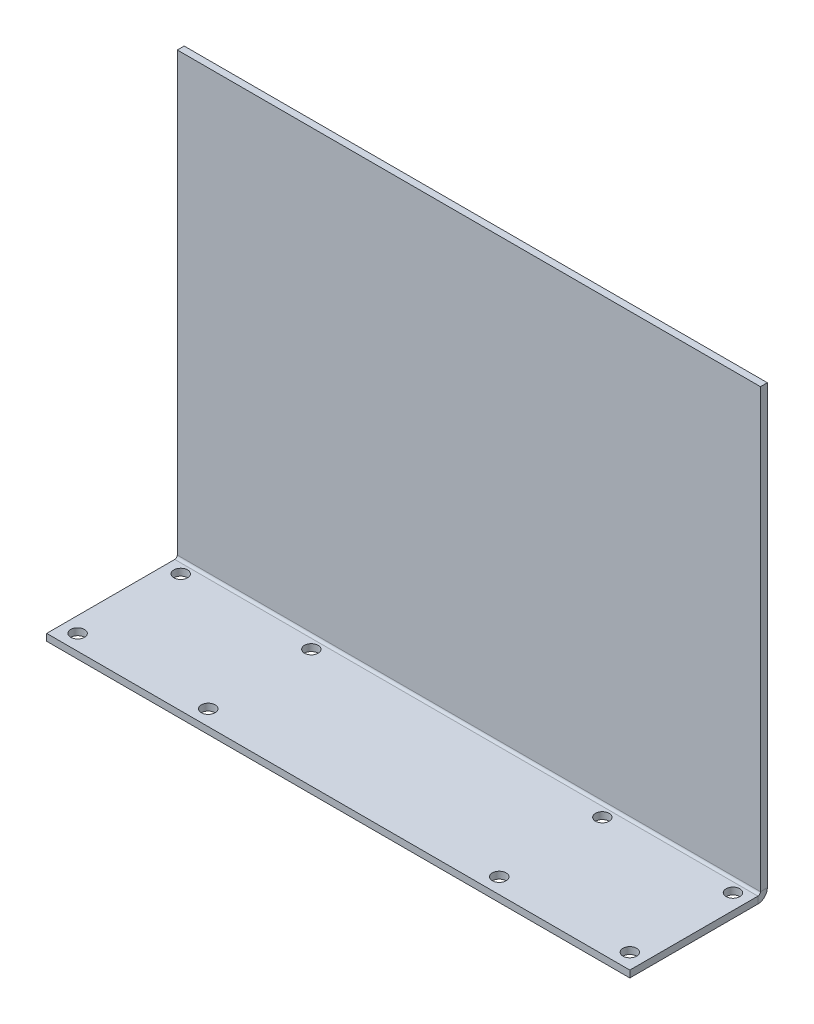
ISO-10303-21;
HEADER;
FILE_DESCRIPTION(('STEP AP214'),'2;1');
FILE_NAME('part.step','',(''),(''),'','','');
FILE_SCHEMA(('AUTOMOTIVE_DESIGN { 1 0 10303 214 1 1 1 1 }'));
ENDSEC;
DATA;
#1=APPLICATION_CONTEXT('core data for automotive mechanical design processes');
#2=APPLICATION_PROTOCOL_DEFINITION('international standard','automotive_design',2000,#1);
#3=PRODUCT_CONTEXT('',#1,'mechanical');
#4=PRODUCT('Part','Part','',(#3));
#5=PRODUCT_RELATED_PRODUCT_CATEGORY('part','',(#4));
#6=PRODUCT_DEFINITION_FORMATION('','',#4);
#7=PRODUCT_DEFINITION_CONTEXT('part definition',#1,'design');
#8=PRODUCT_DEFINITION('design','',#6,#7);
#9=PRODUCT_DEFINITION_SHAPE('','',#8);
#10=(LENGTH_UNIT() NAMED_UNIT(*) SI_UNIT(.MILLI.,.METRE.));
#11=(NAMED_UNIT(*) PLANE_ANGLE_UNIT() SI_UNIT($,.RADIAN.));
#12=(NAMED_UNIT(*) SI_UNIT($,.STERADIAN.) SOLID_ANGLE_UNIT());
#13=UNCERTAINTY_MEASURE_WITH_UNIT(LENGTH_MEASURE(1.E-05),#10,'distance_accuracy_value','');
#14=(GEOMETRIC_REPRESENTATION_CONTEXT(3) GLOBAL_UNCERTAINTY_ASSIGNED_CONTEXT((#13)) GLOBAL_UNIT_ASSIGNED_CONTEXT((#10,
#11,#12)) REPRESENTATION_CONTEXT('',''));
#15=CARTESIAN_POINT('',(0.,0.,0.));
#16=DIRECTION('',(0.,0.,1.));
#17=DIRECTION('',(1.,0.,0.));
#18=AXIS2_PLACEMENT_3D('',#15,#16,#17);
#19=CARTESIAN_POINT('',(-70.6153846153846,-2.,-33.2307692307692));
#20=DIRECTION('',(-1.,0.,0.));
#21=DIRECTION('',(0.,0.,1.));
#22=AXIS2_PLACEMENT_3D('',#19,#20,#21);
#23=PLANE('',#22);
#24=DIRECTION('',(0.,0.,1.));
#25=VECTOR('',#24,1.);
#26=CARTESIAN_POINT('',(-70.6153846153846,0.,-33.2307692307692));
#27=LINE('',#26,#25);
#28=CARTESIAN_POINT('',(-70.6153846153846,0.,-30.4941692307692));
#29=VERTEX_POINT('',#28);
#30=CARTESIAN_POINT('',(-70.6153846153846,0.,6.76923076923076));
#31=VERTEX_POINT('',#30);
#32=EDGE_CURVE('E107',#29,#31,#27,.T.);
#33=ORIENTED_EDGE('',*,*,#32,.F.);
#34=DIRECTION('',(0.,-1.,0.));
#35=VECTOR('',#34,1.);
#36=CARTESIAN_POINT('',(-70.6153846153846,0.,-30.4941692307692));
#37=LINE('',#36,#35);
#38=CARTESIAN_POINT('',(-70.6153846153846,-2.,-30.4941692307692));
#39=VERTEX_POINT('',#38);
#40=EDGE_CURVE('E116',#29,#39,#37,.T.);
#41=ORIENTED_EDGE('',*,*,#40,.T.);
#42=DIRECTION('',(0.,0.,1.));
#43=VECTOR('',#42,1.);
#44=CARTESIAN_POINT('',(-70.6153846153846,-2.,-33.2307692307692));
#45=LINE('',#44,#43);
#46=CARTESIAN_POINT('',(-70.6153846153846,-2.,6.76923076923076));
#47=VERTEX_POINT('',#46);
#48=EDGE_CURVE('E104',#39,#47,#45,.T.);
#49=ORIENTED_EDGE('',*,*,#48,.T.);
#50=DIRECTION('',(0.,1.,0.));
#51=VECTOR('',#50,1.);
#52=CARTESIAN_POINT('',(-70.6153846153846,-2.,6.76923076923076));
#53=LINE('',#52,#51);
#54=EDGE_CURVE('E62',#47,#31,#53,.T.);
#55=ORIENTED_EDGE('',*,*,#54,.T.);
#56=EDGE_LOOP('',(#33,#41,#49,#55));
#57=FACE_BOUND('',#56,.T.);
#58=ADVANCED_FACE('F59',(#57),#23,.T.);
#59=CARTESIAN_POINT('',(0.,-2.,0.));
#60=DIRECTION('',(0.,1.,0.));
#61=DIRECTION('',(0.,0.,1.));
#62=AXIS2_PLACEMENT_3D('',#59,#60,#61);
#63=PLANE('',#62);
#64=CARTESIAN_POINT('',(56.5546153846154,-2.,-27.7307692307692));
#65=DIRECTION('',(0.,1.,0.));
#66=DIRECTION('',(0.,0.,1.));
#67=AXIS2_PLACEMENT_3D('',#64,#65,#66);
#68=CIRCLE('',#67,2.);
#69=CARTESIAN_POINT('',(56.5546153846154,-2.,-25.7307692307692));
#70=VERTEX_POINT('',#69);
#71=EDGE_CURVE('E217',#70,#70,#68,.T.);
#72=ORIENTED_EDGE('',*,*,#71,.T.);
#73=EDGE_LOOP('',(#72));
#74=FACE_BOUND('',#73,.T.);
#75=CARTESIAN_POINT('',(94.5546153846154,-2.,-27.7307692307692));
#76=DIRECTION('',(0.,1.,0.));
#77=DIRECTION('',(0.,0.,1.));
#78=AXIS2_PLACEMENT_3D('',#75,#76,#77);
#79=CIRCLE('',#78,2.);
#80=CARTESIAN_POINT('',(94.5546153846154,-2.,-25.7307692307692));
#81=VERTEX_POINT('',#80);
#82=EDGE_CURVE('E211',#81,#81,#79,.T.);
#83=ORIENTED_EDGE('',*,*,#82,.T.);
#84=EDGE_LOOP('',(#83));
#85=FACE_BOUND('',#84,.T.);
#86=CARTESIAN_POINT('',(94.5546153846154,-2.,2.26923076923076));
#87=DIRECTION('',(0.,1.,0.));
#88=DIRECTION('',(0.,0.,1.));
#89=AXIS2_PLACEMENT_3D('',#86,#87,#88);
#90=CIRCLE('',#89,2.);
#91=CARTESIAN_POINT('',(94.5546153846154,-2.,4.26923076923076));
#92=VERTEX_POINT('',#91);
#93=EDGE_CURVE('E205',#92,#92,#90,.T.);
#94=ORIENTED_EDGE('',*,*,#93,.T.);
#95=EDGE_LOOP('',(#94));
#96=FACE_BOUND('',#95,.T.);
#97=CARTESIAN_POINT('',(56.5546153846154,-2.,2.26923076923076));
#98=DIRECTION('',(0.,1.,0.));
#99=DIRECTION('',(0.,0.,1.));
#100=AXIS2_PLACEMENT_3D('',#97,#98,#99);
#101=CIRCLE('',#100,2.);
#102=CARTESIAN_POINT('',(56.5546153846154,-2.,4.26923076923076));
#103=VERTEX_POINT('',#102);
#104=EDGE_CURVE('E199',#103,#103,#101,.T.);
#105=ORIENTED_EDGE('',*,*,#104,.T.);
#106=EDGE_LOOP('',(#105));
#107=FACE_BOUND('',#106,.T.);
#108=CARTESIAN_POINT('',(-66.1153846153846,-2.,-27.7307692307692));
#109=DIRECTION('',(0.,1.,0.));
#110=DIRECTION('',(0.,0.,1.));
#111=AXIS2_PLACEMENT_3D('',#108,#109,#110);
#112=CIRCLE('',#111,2.);
#113=CARTESIAN_POINT('',(-66.1153846153846,-2.,-25.7307692307692));
#114=VERTEX_POINT('',#113);
#115=EDGE_CURVE('E193',#114,#114,#112,.T.);
#116=ORIENTED_EDGE('',*,*,#115,.T.);
#117=EDGE_LOOP('',(#116));
#118=FACE_BOUND('',#117,.T.);
#119=CARTESIAN_POINT('',(-28.1153846153846,-2.,-27.7307692307692));
#120=DIRECTION('',(0.,1.,0.));
#121=DIRECTION('',(0.,0.,1.));
#122=AXIS2_PLACEMENT_3D('',#119,#120,#121);
#123=CIRCLE('',#122,2.);
#124=CARTESIAN_POINT('',(-28.1153846153846,-2.,-25.7307692307692));
#125=VERTEX_POINT('',#124);
#126=EDGE_CURVE('E187',#125,#125,#123,.T.);
#127=ORIENTED_EDGE('',*,*,#126,.T.);
#128=EDGE_LOOP('',(#127));
#129=FACE_BOUND('',#128,.T.);
#130=CARTESIAN_POINT('',(-28.1153846153846,-2.,2.26923076923075));
#131=DIRECTION('',(0.,1.,0.));
#132=DIRECTION('',(0.,0.,1.));
#133=AXIS2_PLACEMENT_3D('',#130,#131,#132);
#134=CIRCLE('',#133,2.);
#135=CARTESIAN_POINT('',(-28.1153846153846,-2.,4.26923076923075));
#136=VERTEX_POINT('',#135);
#137=EDGE_CURVE('E181',#136,#136,#134,.T.);
#138=ORIENTED_EDGE('',*,*,#137,.T.);
#139=EDGE_LOOP('',(#138));
#140=FACE_BOUND('',#139,.T.);
#141=CARTESIAN_POINT('',(-66.1153846153846,-2.,2.26923076923076));
#142=DIRECTION('',(0.,1.,0.));
#143=DIRECTION('',(0.,0.,1.));
#144=AXIS2_PLACEMENT_3D('',#141,#142,#143);
#145=CIRCLE('',#144,2.);
#146=CARTESIAN_POINT('',(-66.1153846153846,-2.,4.26923076923076));
#147=VERTEX_POINT('',#146);
#148=EDGE_CURVE('E175',#147,#147,#145,.T.);
#149=ORIENTED_EDGE('',*,*,#148,.T.);
#150=EDGE_LOOP('',(#149));
#151=FACE_BOUND('',#150,.T.);
#152=DIRECTION('',(-1.,0.,0.));
#153=VECTOR('',#152,1.);
#154=CARTESIAN_POINT('',(-70.6153846153846,-2.,-30.4941692307692));
#155=LINE('',#154,#153);
#156=CARTESIAN_POINT('',(99.0546153846153,-2.,-30.4941692307692));
#157=VERTEX_POINT('',#156);
#158=EDGE_CURVE('E132',#39,#157,#155,.F.);
#159=ORIENTED_EDGE('',*,*,#158,.T.);
#160=DIRECTION('',(0.,0.,-1.));
#161=VECTOR('',#160,1.);
#162=CARTESIAN_POINT('',(99.0546153846153,-2.,-33.2307692307692));
#163=LINE('',#162,#161);
#164=CARTESIAN_POINT('',(99.0546153846154,-2.,6.76923076923076));
#165=VERTEX_POINT('',#164);
#166=EDGE_CURVE('E112',#165,#157,#163,.T.);
#167=ORIENTED_EDGE('',*,*,#166,.F.);
#168=DIRECTION('',(1.,0.,0.));
#169=VECTOR('',#168,1.);
#170=CARTESIAN_POINT('',(-70.6153846153846,-2.,6.76923076923076));
#171=LINE('',#170,#169);
#172=EDGE_CURVE('E97',#47,#165,#171,.T.);
#173=ORIENTED_EDGE('',*,*,#172,.F.);
#174=ORIENTED_EDGE('',*,*,#48,.F.);
#175=EDGE_LOOP('',(#159,#167,#173,#174));
#176=FACE_BOUND('',#175,.T.);
#177=ADVANCED_FACE('F221',(#74,#85,#96,#107,#118,#129,#140,#151,#176),#63,.F.);
#178=CARTESIAN_POINT('',(0.,0.,0.));
#179=DIRECTION('',(0.,1.,0.));
#180=DIRECTION('',(0.,0.,1.));
#181=AXIS2_PLACEMENT_3D('',#178,#179,#180);
#182=PLANE('',#181);
#183=CARTESIAN_POINT('',(56.5546153846154,0.,-27.7307692307692));
#184=DIRECTION('',(0.,1.,0.));
#185=DIRECTION('',(0.,0.,1.));
#186=AXIS2_PLACEMENT_3D('',#183,#184,#185);
#187=CIRCLE('',#186,2.);
#188=CARTESIAN_POINT('',(56.5546153846154,0.,-25.7307692307692));
#189=VERTEX_POINT('',#188);
#190=EDGE_CURVE('E214',#189,#189,#187,.T.);
#191=ORIENTED_EDGE('',*,*,#190,.F.);
#192=EDGE_LOOP('',(#191));
#193=FACE_BOUND('',#192,.T.);
#194=CARTESIAN_POINT('',(94.5546153846154,0.,-27.7307692307692));
#195=DIRECTION('',(0.,1.,0.));
#196=DIRECTION('',(0.,0.,1.));
#197=AXIS2_PLACEMENT_3D('',#194,#195,#196);
#198=CIRCLE('',#197,2.);
#199=CARTESIAN_POINT('',(94.5546153846154,0.,-25.7307692307692));
#200=VERTEX_POINT('',#199);
#201=EDGE_CURVE('E208',#200,#200,#198,.T.);
#202=ORIENTED_EDGE('',*,*,#201,.F.);
#203=EDGE_LOOP('',(#202));
#204=FACE_BOUND('',#203,.T.);
#205=CARTESIAN_POINT('',(94.5546153846154,0.,2.26923076923076));
#206=DIRECTION('',(0.,1.,0.));
#207=DIRECTION('',(0.,0.,1.));
#208=AXIS2_PLACEMENT_3D('',#205,#206,#207);
#209=CIRCLE('',#208,2.);
#210=CARTESIAN_POINT('',(94.5546153846154,0.,4.26923076923076));
#211=VERTEX_POINT('',#210);
#212=EDGE_CURVE('E202',#211,#211,#209,.T.);
#213=ORIENTED_EDGE('',*,*,#212,.F.);
#214=EDGE_LOOP('',(#213));
#215=FACE_BOUND('',#214,.T.);
#216=CARTESIAN_POINT('',(56.5546153846154,0.,2.26923076923076));
#217=DIRECTION('',(0.,1.,0.));
#218=DIRECTION('',(0.,0.,1.));
#219=AXIS2_PLACEMENT_3D('',#216,#217,#218);
#220=CIRCLE('',#219,2.);
#221=CARTESIAN_POINT('',(56.5546153846154,0.,4.26923076923076));
#222=VERTEX_POINT('',#221);
#223=EDGE_CURVE('E196',#222,#222,#220,.T.);
#224=ORIENTED_EDGE('',*,*,#223,.F.);
#225=EDGE_LOOP('',(#224));
#226=FACE_BOUND('',#225,.T.);
#227=CARTESIAN_POINT('',(-66.1153846153846,0.,-27.7307692307692));
#228=DIRECTION('',(0.,1.,0.));
#229=DIRECTION('',(0.,0.,1.));
#230=AXIS2_PLACEMENT_3D('',#227,#228,#229);
#231=CIRCLE('',#230,2.);
#232=CARTESIAN_POINT('',(-66.1153846153846,0.,-25.7307692307692));
#233=VERTEX_POINT('',#232);
#234=EDGE_CURVE('E190',#233,#233,#231,.T.);
#235=ORIENTED_EDGE('',*,*,#234,.F.);
#236=EDGE_LOOP('',(#235));
#237=FACE_BOUND('',#236,.T.);
#238=CARTESIAN_POINT('',(-28.1153846153846,0.,-27.7307692307692));
#239=DIRECTION('',(0.,1.,0.));
#240=DIRECTION('',(0.,0.,1.));
#241=AXIS2_PLACEMENT_3D('',#238,#239,#240);
#242=CIRCLE('',#241,2.);
#243=CARTESIAN_POINT('',(-28.1153846153846,0.,-25.7307692307692));
#244=VERTEX_POINT('',#243);
#245=EDGE_CURVE('E184',#244,#244,#242,.T.);
#246=ORIENTED_EDGE('',*,*,#245,.F.);
#247=EDGE_LOOP('',(#246));
#248=FACE_BOUND('',#247,.T.);
#249=CARTESIAN_POINT('',(-28.1153846153846,0.,2.26923076923075));
#250=DIRECTION('',(0.,1.,0.));
#251=DIRECTION('',(0.,0.,1.));
#252=AXIS2_PLACEMENT_3D('',#249,#250,#251);
#253=CIRCLE('',#252,2.);
#254=CARTESIAN_POINT('',(-28.1153846153846,0.,4.26923076923075));
#255=VERTEX_POINT('',#254);
#256=EDGE_CURVE('E178',#255,#255,#253,.T.);
#257=ORIENTED_EDGE('',*,*,#256,.F.);
#258=EDGE_LOOP('',(#257));
#259=FACE_BOUND('',#258,.T.);
#260=CARTESIAN_POINT('',(-66.1153846153846,0.,2.26923076923076));
#261=DIRECTION('',(0.,1.,0.));
#262=DIRECTION('',(0.,0.,1.));
#263=AXIS2_PLACEMENT_3D('',#260,#261,#262);
#264=CIRCLE('',#263,2.);
#265=CARTESIAN_POINT('',(-66.1153846153846,0.,4.26923076923076));
#266=VERTEX_POINT('',#265);
#267=EDGE_CURVE('E141',#266,#266,#264,.T.);
#268=ORIENTED_EDGE('',*,*,#267,.F.);
#269=EDGE_LOOP('',(#268));
#270=FACE_BOUND('',#269,.T.);
#271=DIRECTION('',(0.,0.,-1.));
#272=VECTOR('',#271,1.);
#273=CARTESIAN_POINT('',(99.0546153846153,0.,-33.2307692307692));
#274=LINE('',#273,#272);
#275=CARTESIAN_POINT('',(99.0546153846154,0.,6.76923076923076));
#276=VERTEX_POINT('',#275);
#277=CARTESIAN_POINT('',(99.0546153846153,0.,-30.4941692307692));
#278=VERTEX_POINT('',#277);
#279=EDGE_CURVE('E99',#276,#278,#274,.T.);
#280=ORIENTED_EDGE('',*,*,#279,.T.);
#281=DIRECTION('',(-1.,0.,0.));
#282=VECTOR('',#281,1.);
#283=CARTESIAN_POINT('',(-70.6153846153846,0.,-30.4941692307692));
#284=LINE('',#283,#282);
#285=EDGE_CURVE('E73',#29,#278,#284,.F.);
#286=ORIENTED_EDGE('',*,*,#285,.F.);
#287=ORIENTED_EDGE('',*,*,#32,.T.);
#288=DIRECTION('',(1.,0.,0.));
#289=VECTOR('',#288,1.);
#290=CARTESIAN_POINT('',(-70.6153846153846,0.,6.76923076923076));
#291=LINE('',#290,#289);
#292=EDGE_CURVE('E95',#31,#276,#291,.T.);
#293=ORIENTED_EDGE('',*,*,#292,.T.);
#294=EDGE_LOOP('',(#280,#286,#287,#293));
#295=FACE_BOUND('',#294,.T.);
#296=ADVANCED_FACE('F106',(#193,#204,#215,#226,#237,#248,#259,#270,#295),#182,.T.);
#297=CARTESIAN_POINT('',(99.0546153846153,-2.,-33.2307692307692));
#298=DIRECTION('',(1.,0.,0.));
#299=DIRECTION('',(0.,0.,-1.));
#300=AXIS2_PLACEMENT_3D('',#297,#298,#299);
#301=PLANE('',#300);
#302=DIRECTION('',(0.,-1.,0.));
#303=VECTOR('',#302,1.);
#304=CARTESIAN_POINT('',(99.0546153846153,0.,-30.4941692307692));
#305=LINE('',#304,#303);
#306=EDGE_CURVE('E103',#278,#157,#305,.T.);
#307=ORIENTED_EDGE('',*,*,#306,.F.);
#308=ORIENTED_EDGE('',*,*,#279,.F.);
#309=DIRECTION('',(0.,1.,0.));
#310=VECTOR('',#309,1.);
#311=CARTESIAN_POINT('',(99.0546153846154,-2.,6.76923076923076));
#312=LINE('',#311,#310);
#313=EDGE_CURVE('E13',#165,#276,#312,.T.);
#314=ORIENTED_EDGE('',*,*,#313,.F.);
#315=ORIENTED_EDGE('',*,*,#166,.T.);
#316=EDGE_LOOP('',(#307,#308,#314,#315));
#317=FACE_BOUND('',#316,.T.);
#318=ADVANCED_FACE('F100',(#317),#301,.T.);
#319=CARTESIAN_POINT('',(-70.6153846153846,-2.,6.76923076923076));
#320=DIRECTION('',(0.,0.,1.));
#321=DIRECTION('',(1.,0.,0.));
#322=AXIS2_PLACEMENT_3D('',#319,#320,#321);
#323=PLANE('',#322);
#324=ORIENTED_EDGE('',*,*,#292,.F.);
#325=ORIENTED_EDGE('',*,*,#54,.F.);
#326=ORIENTED_EDGE('',*,*,#172,.T.);
#327=ORIENTED_EDGE('',*,*,#313,.T.);
#328=EDGE_LOOP('',(#324,#325,#326,#327));
#329=FACE_BOUND('',#328,.T.);
#330=ADVANCED_FACE('F92',(#329),#323,.T.);
#331=CARTESIAN_POINT('',(99.0546153846153,0.736599999999989,-30.4941692307692));
#332=DIRECTION('',(1.,0.,0.));
#333=DIRECTION('',(0.,1.,0.));
#334=AXIS2_PLACEMENT_3D('',#331,#332,#333);
#335=PLANE('',#334);
#336=DIRECTION('',(0.,0.,1.));
#337=VECTOR('',#336,1.);
#338=CARTESIAN_POINT('',(99.0546153846153,0.736600000000011,-33.2307692307692));
#339=LINE('',#338,#337);
#340=CARTESIAN_POINT('',(99.0546153846153,0.736599999999986,-31.2307692307692));
#341=VERTEX_POINT('',#340);
#342=CARTESIAN_POINT('',(99.0546153846153,0.736599999999979,-33.2307692307692));
#343=VERTEX_POINT('',#342);
#344=EDGE_CURVE('E137',#341,#343,#339,.F.);
#345=ORIENTED_EDGE('',*,*,#344,.F.);
#346=CARTESIAN_POINT('',(99.0546153846153,0.736599999999989,-30.4941692307692));
#347=DIRECTION('',(-1.,0.,0.));
#348=DIRECTION('',(0.,-1.,0.));
#349=AXIS2_PLACEMENT_3D('',#346,#347,#348);
#350=CIRCLE('',#349,0.7366);
#351=EDGE_CURVE('E126',#278,#341,#350,.F.);
#352=ORIENTED_EDGE('',*,*,#351,.F.);
#353=ORIENTED_EDGE('',*,*,#306,.T.);
#354=CARTESIAN_POINT('',(99.0546153846153,0.736599999999989,-30.4941692307692));
#355=DIRECTION('',(-1.,0.,0.));
#356=DIRECTION('',(0.,-1.,0.));
#357=AXIS2_PLACEMENT_3D('',#354,#355,#356);
#358=CIRCLE('',#357,2.7366);
#359=EDGE_CURVE('E119',#157,#343,#358,.F.);
#360=ORIENTED_EDGE('',*,*,#359,.T.);
#361=EDGE_LOOP('',(#345,#352,#353,#360));
#362=FACE_BOUND('',#361,.T.);
#363=ADVANCED_FACE('F318',(#362),#335,.T.);
#364=CARTESIAN_POINT('',(-70.6153846153846,0.736600000000002,-30.4941692307692));
#365=DIRECTION('',(1.,0.,0.));
#366=DIRECTION('',(0.,1.,0.));
#367=AXIS2_PLACEMENT_3D('',#364,#365,#366);
#368=PLANE('',#367);
#369=CARTESIAN_POINT('',(-70.6153846153846,0.736600000000002,-30.4941692307692));
#370=DIRECTION('',(-1.,0.,0.));
#371=DIRECTION('',(0.,-1.,0.));
#372=AXIS2_PLACEMENT_3D('',#369,#370,#371);
#373=CIRCLE('',#372,0.7366);
#374=CARTESIAN_POINT('',(-70.6153846153846,0.736599999999999,-31.2307692307692));
#375=VERTEX_POINT('',#374);
#376=EDGE_CURVE('E121',#375,#29,#373,.T.);
#377=ORIENTED_EDGE('',*,*,#376,.F.);
#378=DIRECTION('',(0.,0.,1.));
#379=VECTOR('',#378,1.);
#380=CARTESIAN_POINT('',(-70.6153846153846,0.736600000000004,-31.2307692307692));
#381=LINE('',#380,#379);
#382=CARTESIAN_POINT('',(-70.6153846153846,0.736600000000018,-33.2307692307692));
#383=VERTEX_POINT('',#382);
#384=EDGE_CURVE('E144',#375,#383,#381,.F.);
#385=ORIENTED_EDGE('',*,*,#384,.T.);
#386=CARTESIAN_POINT('',(-70.6153846153846,0.736600000000002,-30.4941692307692));
#387=DIRECTION('',(-1.,0.,0.));
#388=DIRECTION('',(0.,-1.,0.));
#389=AXIS2_PLACEMENT_3D('',#386,#387,#388);
#390=CIRCLE('',#389,2.7366);
#391=EDGE_CURVE('E129',#383,#39,#390,.T.);
#392=ORIENTED_EDGE('',*,*,#391,.T.);
#393=ORIENTED_EDGE('',*,*,#40,.F.);
#394=EDGE_LOOP('',(#377,#385,#392,#393));
#395=FACE_BOUND('',#394,.T.);
#396=ADVANCED_FACE('F277',(#395),#368,.F.);
#397=CARTESIAN_POINT('',(-70.6153846153846,0.736600000000002,-30.4941692307692));
#398=DIRECTION('',(-1.,0.,0.));
#399=DIRECTION('',(0.,0.,-1.));
#400=AXIS2_PLACEMENT_3D('',#397,#398,#399);
#401=CYLINDRICAL_SURFACE('',#400,2.7366);
#402=ORIENTED_EDGE('',*,*,#158,.F.);
#403=ORIENTED_EDGE('',*,*,#391,.F.);
#404=DIRECTION('',(-1.,0.,0.));
#405=VECTOR('',#404,1.);
#406=CARTESIAN_POINT('',(99.0546153846153,0.736600000000011,-33.2307692307692));
#407=LINE('',#406,#405);
#408=EDGE_CURVE('E147',#383,#343,#407,.F.);
#409=ORIENTED_EDGE('',*,*,#408,.T.);
#410=ORIENTED_EDGE('',*,*,#359,.F.);
#411=EDGE_LOOP('',(#402,#403,#409,#410));
#412=FACE_BOUND('',#411,.T.);
#413=ADVANCED_FACE('F319',(#412),#401,.T.);
#414=CARTESIAN_POINT('',(-70.6153846153846,0.736600000000002,-30.4941692307692));
#415=DIRECTION('',(-1.,0.,0.));
#416=DIRECTION('',(0.,0.,-1.));
#417=AXIS2_PLACEMENT_3D('',#414,#415,#416);
#418=CYLINDRICAL_SURFACE('',#417,0.7366);
#419=ORIENTED_EDGE('',*,*,#285,.T.);
#420=ORIENTED_EDGE('',*,*,#351,.T.);
#421=DIRECTION('',(-1.,0.,0.));
#422=VECTOR('',#421,1.);
#423=CARTESIAN_POINT('',(99.0546153846153,0.736599999999997,-31.2307692307692));
#424=LINE('',#423,#422);
#425=EDGE_CURVE('E140',#341,#375,#424,.T.);
#426=ORIENTED_EDGE('',*,*,#425,.T.);
#427=ORIENTED_EDGE('',*,*,#376,.T.);
#428=EDGE_LOOP('',(#419,#420,#426,#427));
#429=FACE_BOUND('',#428,.T.);
#430=ADVANCED_FACE('F282',(#429),#418,.F.);
#431=CARTESIAN_POINT('',(99.0546153846153,0.,-33.2307692307692));
#432=DIRECTION('',(-1.,0.,0.));
#433=DIRECTION('',(0.,0.,1.));
#434=AXIS2_PLACEMENT_3D('',#431,#432,#433);
#435=PLANE('',#434);
#436=ORIENTED_EDGE('',*,*,#344,.T.);
#437=DIRECTION('',(0.,-1.,0.));
#438=VECTOR('',#437,1.);
#439=CARTESIAN_POINT('',(99.0546153846153,-1.22275353696453E-13,-33.2307692307692));
#440=LINE('',#439,#438);
#441=CARTESIAN_POINT('',(99.0546153846153,128.,-33.2307692307697));
#442=VERTEX_POINT('',#441);
#443=EDGE_CURVE('E159',#442,#343,#440,.T.);
#444=ORIENTED_EDGE('',*,*,#443,.F.);
#445=DIRECTION('',(0.,0.,1.));
#446=VECTOR('',#445,1.);
#447=CARTESIAN_POINT('',(99.0546153846153,128.,-33.2307692307697));
#448=LINE('',#447,#446);
#449=CARTESIAN_POINT('',(99.0546153846153,128.,-31.2307692307697));
#450=VERTEX_POINT('',#449);
#451=EDGE_CURVE('E168',#442,#450,#448,.T.);
#452=ORIENTED_EDGE('',*,*,#451,.T.);
#453=DIRECTION('',(0.,1.,0.));
#454=VECTOR('',#453,1.);
#455=CARTESIAN_POINT('',(99.0546153846153,0.,-31.2307692307692));
#456=LINE('',#455,#454);
#457=EDGE_CURVE('E150',#450,#341,#456,.F.);
#458=ORIENTED_EDGE('',*,*,#457,.T.);
#459=EDGE_LOOP('',(#436,#444,#452,#458));
#460=FACE_BOUND('',#459,.T.);
#461=ADVANCED_FACE('F297',(#460),#435,.F.);
#462=CARTESIAN_POINT('',(-70.6153846153846,128.,-33.2307692307697));
#463=DIRECTION('',(1.,0.,0.));
#464=DIRECTION('',(0.,0.,-1.));
#465=AXIS2_PLACEMENT_3D('',#462,#463,#464);
#466=PLANE('',#465);
#467=ORIENTED_EDGE('',*,*,#384,.F.);
#468=DIRECTION('',(0.,-1.,0.));
#469=VECTOR('',#468,1.);
#470=CARTESIAN_POINT('',(-70.6153846153846,128.,-31.2307692307697));
#471=LINE('',#470,#469);
#472=CARTESIAN_POINT('',(-70.6153846153846,128.,-31.2307692307697));
#473=VERTEX_POINT('',#472);
#474=EDGE_CURVE('E153',#375,#473,#471,.F.);
#475=ORIENTED_EDGE('',*,*,#474,.T.);
#476=DIRECTION('',(0.,0.,1.));
#477=VECTOR('',#476,1.);
#478=CARTESIAN_POINT('',(-70.6153846153846,128.,-33.2307692307697));
#479=LINE('',#478,#477);
#480=CARTESIAN_POINT('',(-70.6153846153846,128.,-33.2307692307697));
#481=VERTEX_POINT('',#480);
#482=EDGE_CURVE('E124',#481,#473,#479,.T.);
#483=ORIENTED_EDGE('',*,*,#482,.F.);
#484=DIRECTION('',(0.,1.,0.));
#485=VECTOR('',#484,1.);
#486=CARTESIAN_POINT('',(-70.6153846153846,-1.22275353696453E-13,-33.2307692307692));
#487=LINE('',#486,#485);
#488=EDGE_CURVE('E162',#383,#481,#487,.T.);
#489=ORIENTED_EDGE('',*,*,#488,.F.);
#490=EDGE_LOOP('',(#467,#475,#483,#489));
#491=FACE_BOUND('',#490,.T.);
#492=ADVANCED_FACE('F325',(#491),#466,.F.);
#493=CARTESIAN_POINT('',(0.,-1.22275353696453E-13,-33.2307692307692));
#494=DIRECTION('',(0.,0.,1.));
#495=DIRECTION('',(0.,-1.,0.));
#496=AXIS2_PLACEMENT_3D('',#493,#494,#495);
#497=PLANE('',#496);
#498=ORIENTED_EDGE('',*,*,#408,.F.);
#499=ORIENTED_EDGE('',*,*,#488,.T.);
#500=DIRECTION('',(1.,0.,0.));
#501=VECTOR('',#500,1.);
#502=CARTESIAN_POINT('',(0.,128.,-33.2307692307697));
#503=LINE('',#502,#501);
#504=EDGE_CURVE('E165',#481,#442,#503,.T.);
#505=ORIENTED_EDGE('',*,*,#504,.T.);
#506=ORIENTED_EDGE('',*,*,#443,.T.);
#507=EDGE_LOOP('',(#498,#499,#505,#506));
#508=FACE_BOUND('',#507,.T.);
#509=ADVANCED_FACE('F322',(#508),#497,.F.);
#510=CARTESIAN_POINT('',(0.,-1.15292391018766E-13,-31.2307692307692));
#511=DIRECTION('',(0.,0.,1.));
#512=DIRECTION('',(0.,-1.,0.));
#513=AXIS2_PLACEMENT_3D('',#510,#511,#512);
#514=PLANE('',#513);
#515=ORIENTED_EDGE('',*,*,#474,.F.);
#516=ORIENTED_EDGE('',*,*,#425,.F.);
#517=ORIENTED_EDGE('',*,*,#457,.F.);
#518=DIRECTION('',(-1.,0.,0.));
#519=VECTOR('',#518,1.);
#520=CARTESIAN_POINT('',(99.0546153846153,128.,-31.2307692307697));
#521=LINE('',#520,#519);
#522=EDGE_CURVE('E156',#473,#450,#521,.F.);
#523=ORIENTED_EDGE('',*,*,#522,.F.);
#524=EDGE_LOOP('',(#515,#516,#517,#523));
#525=FACE_BOUND('',#524,.T.);
#526=ADVANCED_FACE('F261',(#525),#514,.T.);
#527=CARTESIAN_POINT('',(99.0546153846153,128.,-33.2307692307697));
#528=DIRECTION('',(0.,-1.,0.));
#529=DIRECTION('',(0.,0.,-1.));
#530=AXIS2_PLACEMENT_3D('',#527,#528,#529);
#531=PLANE('',#530);
#532=ORIENTED_EDGE('',*,*,#522,.T.);
#533=ORIENTED_EDGE('',*,*,#451,.F.);
#534=ORIENTED_EDGE('',*,*,#504,.F.);
#535=ORIENTED_EDGE('',*,*,#482,.T.);
#536=EDGE_LOOP('',(#532,#533,#534,#535));
#537=FACE_BOUND('',#536,.T.);
#538=ADVANCED_FACE('F251',(#537),#531,.F.);
#539=CARTESIAN_POINT('',(-66.1153846153846,0.,2.26923076923076));
#540=DIRECTION('',(0.,1.,0.));
#541=DIRECTION('',(0.,0.,1.));
#542=AXIS2_PLACEMENT_3D('',#539,#540,#541);
#543=CYLINDRICAL_SURFACE('',#542,2.);
#544=ORIENTED_EDGE('',*,*,#148,.F.);
#545=EDGE_LOOP('',(#544));
#546=FACE_BOUND('',#545,.T.);
#547=ORIENTED_EDGE('',*,*,#267,.T.);
#548=EDGE_LOOP('',(#547));
#549=FACE_BOUND('',#548,.T.);
#550=ADVANCED_FACE('F248',(#546,#549),#543,.F.);
#551=CARTESIAN_POINT('',(-28.1153846153846,0.,2.26923076923075));
#552=DIRECTION('',(0.,1.,0.));
#553=DIRECTION('',(0.,0.,1.));
#554=AXIS2_PLACEMENT_3D('',#551,#552,#553);
#555=CYLINDRICAL_SURFACE('',#554,2.);
#556=ORIENTED_EDGE('',*,*,#137,.F.);
#557=EDGE_LOOP('',(#556));
#558=FACE_BOUND('',#557,.T.);
#559=ORIENTED_EDGE('',*,*,#256,.T.);
#560=EDGE_LOOP('',(#559));
#561=FACE_BOUND('',#560,.T.);
#562=ADVANCED_FACE('F250',(#558,#561),#555,.F.);
#563=CARTESIAN_POINT('',(-28.1153846153846,0.,-27.7307692307692));
#564=DIRECTION('',(0.,1.,0.));
#565=DIRECTION('',(0.,0.,1.));
#566=AXIS2_PLACEMENT_3D('',#563,#564,#565);
#567=CYLINDRICAL_SURFACE('',#566,2.);
#568=ORIENTED_EDGE('',*,*,#126,.F.);
#569=EDGE_LOOP('',(#568));
#570=FACE_BOUND('',#569,.T.);
#571=ORIENTED_EDGE('',*,*,#245,.T.);
#572=EDGE_LOOP('',(#571));
#573=FACE_BOUND('',#572,.T.);
#574=ADVANCED_FACE('F258',(#570,#573),#567,.F.);
#575=CARTESIAN_POINT('',(-66.1153846153846,0.,-27.7307692307692));
#576=DIRECTION('',(0.,1.,0.));
#577=DIRECTION('',(0.,0.,1.));
#578=AXIS2_PLACEMENT_3D('',#575,#576,#577);
#579=CYLINDRICAL_SURFACE('',#578,2.);
#580=ORIENTED_EDGE('',*,*,#115,.F.);
#581=EDGE_LOOP('',(#580));
#582=FACE_BOUND('',#581,.T.);
#583=ORIENTED_EDGE('',*,*,#234,.T.);
#584=EDGE_LOOP('',(#583));
#585=FACE_BOUND('',#584,.T.);
#586=ADVANCED_FACE('F416',(#582,#585),#579,.F.);
#587=CARTESIAN_POINT('',(56.5546153846154,0.,2.26923076923076));
#588=DIRECTION('',(0.,1.,0.));
#589=DIRECTION('',(0.,0.,1.));
#590=AXIS2_PLACEMENT_3D('',#587,#588,#589);
#591=CYLINDRICAL_SURFACE('',#590,2.);
#592=ORIENTED_EDGE('',*,*,#104,.F.);
#593=EDGE_LOOP('',(#592));
#594=FACE_BOUND('',#593,.T.);
#595=ORIENTED_EDGE('',*,*,#223,.T.);
#596=EDGE_LOOP('',(#595));
#597=FACE_BOUND('',#596,.T.);
#598=ADVANCED_FACE('F426',(#594,#597),#591,.F.);
#599=CARTESIAN_POINT('',(94.5546153846154,0.,2.26923076923076));
#600=DIRECTION('',(0.,1.,0.));
#601=DIRECTION('',(0.,0.,1.));
#602=AXIS2_PLACEMENT_3D('',#599,#600,#601);
#603=CYLINDRICAL_SURFACE('',#602,2.);
#604=ORIENTED_EDGE('',*,*,#93,.F.);
#605=EDGE_LOOP('',(#604));
#606=FACE_BOUND('',#605,.T.);
#607=ORIENTED_EDGE('',*,*,#212,.T.);
#608=EDGE_LOOP('',(#607));
#609=FACE_BOUND('',#608,.T.);
#610=ADVANCED_FACE('F450',(#606,#609),#603,.F.);
#611=CARTESIAN_POINT('',(94.5546153846154,0.,-27.7307692307692));
#612=DIRECTION('',(0.,1.,0.));
#613=DIRECTION('',(0.,0.,1.));
#614=AXIS2_PLACEMENT_3D('',#611,#612,#613);
#615=CYLINDRICAL_SURFACE('',#614,2.);
#616=ORIENTED_EDGE('',*,*,#82,.F.);
#617=EDGE_LOOP('',(#616));
#618=FACE_BOUND('',#617,.T.);
#619=ORIENTED_EDGE('',*,*,#201,.T.);
#620=EDGE_LOOP('',(#619));
#621=FACE_BOUND('',#620,.T.);
#622=ADVANCED_FACE('F227',(#618,#621),#615,.F.);
#623=CARTESIAN_POINT('',(56.5546153846154,0.,-27.7307692307692));
#624=DIRECTION('',(0.,1.,0.));
#625=DIRECTION('',(0.,0.,1.));
#626=AXIS2_PLACEMENT_3D('',#623,#624,#625);
#627=CYLINDRICAL_SURFACE('',#626,2.);
#628=ORIENTED_EDGE('',*,*,#71,.F.);
#629=EDGE_LOOP('',(#628));
#630=FACE_BOUND('',#629,.T.);
#631=ORIENTED_EDGE('',*,*,#190,.T.);
#632=EDGE_LOOP('',(#631));
#633=FACE_BOUND('',#632,.T.);
#634=ADVANCED_FACE('F224',(#630,#633),#627,.F.);
#635=CLOSED_SHELL('',(#58,#177,#296,#318,#330,#363,#396,#413,#430,#461,#492,#509,#526,#538,#550,
#562,#574,#586,#598,#610,#622,#634));
#636=MANIFOLD_SOLID_BREP('B2',#635);
#637=ADVANCED_BREP_SHAPE_REPRESENTATION('',(#18,#636),#14);
#638=SHAPE_DEFINITION_REPRESENTATION(#9,#637);
ENDSEC;
END-ISO-10303-21;
